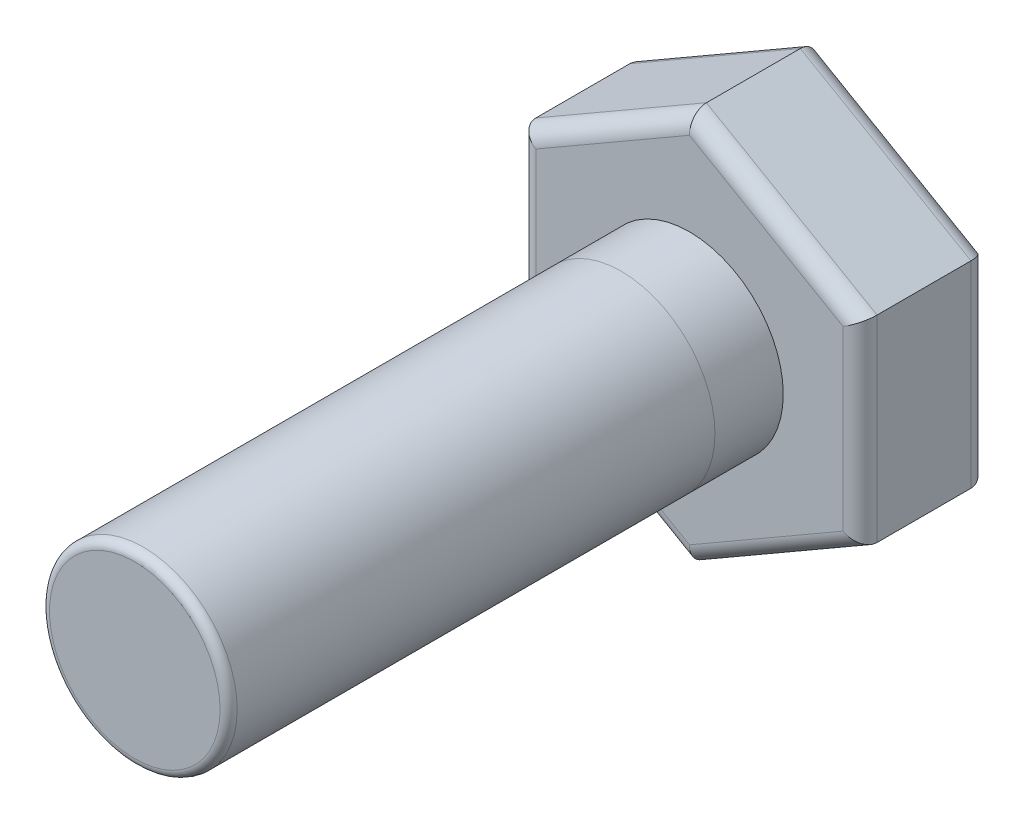
ISO-10303-21;
HEADER;
FILE_DESCRIPTION(('STEP AP214'),'2;1');
FILE_NAME('part.step','',(''),(''),'','','');
FILE_SCHEMA(('AUTOMOTIVE_DESIGN { 1 0 10303 214 1 1 1 1 }'));
ENDSEC;
DATA;
#1=APPLICATION_CONTEXT('core data for automotive mechanical design processes');
#2=APPLICATION_PROTOCOL_DEFINITION('international standard','automotive_design',2000,#1);
#3=PRODUCT_CONTEXT('',#1,'mechanical');
#4=PRODUCT('Part','Part','',(#3));
#5=PRODUCT_RELATED_PRODUCT_CATEGORY('part','',(#4));
#6=PRODUCT_DEFINITION_FORMATION('','',#4);
#7=PRODUCT_DEFINITION_CONTEXT('part definition',#1,'design');
#8=PRODUCT_DEFINITION('design','',#6,#7);
#9=PRODUCT_DEFINITION_SHAPE('','',#8);
#10=(LENGTH_UNIT() NAMED_UNIT(*) SI_UNIT(.MILLI.,.METRE.));
#11=(NAMED_UNIT(*) PLANE_ANGLE_UNIT() SI_UNIT($,.RADIAN.));
#12=(NAMED_UNIT(*) SI_UNIT($,.STERADIAN.) SOLID_ANGLE_UNIT());
#13=UNCERTAINTY_MEASURE_WITH_UNIT(LENGTH_MEASURE(1.E-05),#10,'distance_accuracy_value','');
#14=(GEOMETRIC_REPRESENTATION_CONTEXT(3) GLOBAL_UNCERTAINTY_ASSIGNED_CONTEXT((#13)) GLOBAL_UNIT_ASSIGNED_CONTEXT((#10,
#11,#12)) REPRESENTATION_CONTEXT('',''));
#15=CARTESIAN_POINT('',(0.,0.,0.));
#16=DIRECTION('',(0.,0.,1.));
#17=DIRECTION('',(1.,0.,0.));
#18=AXIS2_PLACEMENT_3D('',#15,#16,#17);
#19=CARTESIAN_POINT('',(20.,34.6410161513775,15.));
#20=DIRECTION('',(0.,0.,1.));
#21=DIRECTION('',(1.,0.,0.));
#22=AXIS2_PLACEMENT_3D('',#19,#20,#21);
#23=PLANE('',#22);
#24=DIRECTION('',(0.866025403784439,-0.5,0.));
#25=VECTOR('',#24,1.);
#26=CARTESIAN_POINT('',(1.,-21.3619599600162,15.));
#27=LINE('',#26,#25);
#28=CARTESIAN_POINT('',(-18.,-10.3923048454132,15.));
#29=VERTEX_POINT('',#28);
#30=CARTESIAN_POINT('',(0.,-20.7846096908265,15.));
#31=VERTEX_POINT('',#30);
#32=EDGE_CURVE('E49',#29,#31,#27,.T.);
#33=ORIENTED_EDGE('',*,*,#32,.T.);
#34=DIRECTION('',(0.866025403784439,0.5,0.));
#35=VECTOR('',#34,1.);
#36=CARTESIAN_POINT('',(19.,-9.81495457622364,15.));
#37=LINE('',#36,#35);
#38=CARTESIAN_POINT('',(18.,-10.3923048454133,15.));
#39=VERTEX_POINT('',#38);
#40=EDGE_CURVE('E204',#31,#39,#37,.T.);
#41=ORIENTED_EDGE('',*,*,#40,.T.);
#42=DIRECTION('',(0.,1.,0.));
#43=VECTOR('',#42,1.);
#44=CARTESIAN_POINT('',(18.,11.5470053837925,15.));
#45=LINE('',#44,#43);
#46=CARTESIAN_POINT('',(18.,10.3923048454133,15.));
#47=VERTEX_POINT('',#46);
#48=EDGE_CURVE('E199',#39,#47,#45,.T.);
#49=ORIENTED_EDGE('',*,*,#48,.T.);
#50=DIRECTION('',(-0.866025403784439,0.5,0.));
#51=VECTOR('',#50,1.);
#52=CARTESIAN_POINT('',(-0.999999999999994,21.3619599600162,15.));
#53=LINE('',#52,#51);
#54=CARTESIAN_POINT('',(0.,20.7846096908265,15.));
#55=VERTEX_POINT('',#54);
#56=EDGE_CURVE('E197',#47,#55,#53,.T.);
#57=ORIENTED_EDGE('',*,*,#56,.T.);
#58=DIRECTION('',(-0.866025403784439,-0.5,0.));
#59=VECTOR('',#58,1.);
#60=CARTESIAN_POINT('',(-19.,9.81495457622364,15.));
#61=LINE('',#60,#59);
#62=CARTESIAN_POINT('',(-18.,10.3923048454133,15.));
#63=VERTEX_POINT('',#62);
#64=EDGE_CURVE('E152',#55,#63,#61,.T.);
#65=ORIENTED_EDGE('',*,*,#64,.T.);
#66=DIRECTION('',(0.,-1.,0.));
#67=VECTOR('',#66,1.);
#68=CARTESIAN_POINT('',(-18.,-11.5470053837925,15.));
#69=LINE('',#68,#67);
#70=EDGE_CURVE('E54',#63,#29,#69,.T.);
#71=ORIENTED_EDGE('',*,*,#70,.T.);
#72=EDGE_LOOP('',(#33,#41,#49,#57,#65,#71));
#73=FACE_BOUND('',#72,.T.);
#74=CARTESIAN_POINT('',(0.,0.,15.));
#75=DIRECTION('',(0.,0.,1.));
#76=DIRECTION('',(1.,0.,0.));
#77=AXIS2_PLACEMENT_3D('',#74,#75,#76);
#78=CIRCLE('',#77,11.);
#79=CARTESIAN_POINT('',(11.,0.,15.));
#80=VERTEX_POINT('',#79);
#81=EDGE_CURVE('E222',#80,#80,#78,.T.);
#82=ORIENTED_EDGE('',*,*,#81,.F.);
#83=EDGE_LOOP('',(#82));
#84=FACE_BOUND('',#83,.T.);
#85=ADVANCED_FACE('F34',(#73,#84),#23,.T.);
#86=CARTESIAN_POINT('',(20.,-11.5470053837925,15.));
#87=DIRECTION('',(-1.,0.,0.));
#88=DIRECTION('',(0.,0.,1.));
#89=AXIS2_PLACEMENT_3D('',#86,#87,#88);
#90=PLANE('',#89);
#91=DIRECTION('',(0.,0.,-1.));
#92=VECTOR('',#91,1.);
#93=CARTESIAN_POINT('',(20.,-11.5470053837925,15.));
#94=LINE('',#93,#92);
#95=CARTESIAN_POINT('',(20.,-11.5470053837925,13.));
#96=VERTEX_POINT('',#95);
#97=CARTESIAN_POINT('',(20.,-11.5470053837925,2.));
#98=VERTEX_POINT('',#97);
#99=EDGE_CURVE('E477',#96,#98,#94,.T.);
#100=ORIENTED_EDGE('',*,*,#99,.T.);
#101=DIRECTION('',(0.,1.,0.));
#102=VECTOR('',#101,1.);
#103=CARTESIAN_POINT('',(20.,-11.5470053837925,2.));
#104=LINE('',#103,#102);
#105=CARTESIAN_POINT('',(20.,11.5470053837925,2.));
#106=VERTEX_POINT('',#105);
#107=EDGE_CURVE('E195',#98,#106,#104,.T.);
#108=ORIENTED_EDGE('',*,*,#107,.T.);
#109=DIRECTION('',(0.,0.,-1.));
#110=VECTOR('',#109,1.);
#111=CARTESIAN_POINT('',(20.,11.5470053837925,15.));
#112=LINE('',#111,#110);
#113=CARTESIAN_POINT('',(20.,11.5470053837925,13.));
#114=VERTEX_POINT('',#113);
#115=EDGE_CURVE('E146',#114,#106,#112,.T.);
#116=ORIENTED_EDGE('',*,*,#115,.F.);
#117=DIRECTION('',(0.,1.,0.));
#118=VECTOR('',#117,1.);
#119=CARTESIAN_POINT('',(20.,-11.5470053837925,13.));
#120=LINE('',#119,#118);
#121=EDGE_CURVE('E193',#114,#96,#120,.F.);
#122=ORIENTED_EDGE('',*,*,#121,.T.);
#123=EDGE_LOOP('',(#100,#108,#116,#122));
#124=FACE_BOUND('',#123,.T.);
#125=ADVANCED_FACE('F256',(#124),#90,.F.);
#126=CARTESIAN_POINT('',(20.,11.5470053837925,15.));
#127=DIRECTION('',(-0.5,-0.866025403784439,0.));
#128=DIRECTION('',(0.866025403784439,-0.5,0.));
#129=AXIS2_PLACEMENT_3D('',#126,#127,#128);
#130=PLANE('',#129);
#131=ORIENTED_EDGE('',*,*,#115,.T.);
#132=DIRECTION('',(-0.866025403784439,0.5,0.));
#133=VECTOR('',#132,1.);
#134=CARTESIAN_POINT('',(20.,11.5470053837925,2.));
#135=LINE('',#134,#133);
#136=CARTESIAN_POINT('',(0.,23.094010767585,2.));
#137=VERTEX_POINT('',#136);
#138=EDGE_CURVE('E145',#106,#137,#135,.T.);
#139=ORIENTED_EDGE('',*,*,#138,.T.);
#140=DIRECTION('',(0.,0.,-1.));
#141=VECTOR('',#140,1.);
#142=CARTESIAN_POINT('',(0.,23.094010767585,15.));
#143=LINE('',#142,#141);
#144=CARTESIAN_POINT('',(0.,23.094010767585,13.));
#145=VERTEX_POINT('',#144);
#146=EDGE_CURVE('E127',#145,#137,#143,.T.);
#147=ORIENTED_EDGE('',*,*,#146,.F.);
#148=DIRECTION('',(-0.866025403784439,0.5,0.));
#149=VECTOR('',#148,1.);
#150=CARTESIAN_POINT('',(20.,11.5470053837925,13.));
#151=LINE('',#150,#149);
#152=EDGE_CURVE('E142',#145,#114,#151,.F.);
#153=ORIENTED_EDGE('',*,*,#152,.T.);
#154=EDGE_LOOP('',(#131,#139,#147,#153));
#155=FACE_BOUND('',#154,.T.);
#156=ADVANCED_FACE('F140',(#155),#130,.F.);
#157=CARTESIAN_POINT('',(0.,23.094010767585,15.));
#158=DIRECTION('',(0.5,-0.866025403784439,0.));
#159=DIRECTION('',(0.866025403784439,0.5,0.));
#160=AXIS2_PLACEMENT_3D('',#157,#158,#159);
#161=PLANE('',#160);
#162=ORIENTED_EDGE('',*,*,#146,.T.);
#163=DIRECTION('',(-0.866025403784439,-0.5,0.));
#164=VECTOR('',#163,1.);
#165=CARTESIAN_POINT('',(0.,23.094010767585,2.));
#166=LINE('',#165,#164);
#167=CARTESIAN_POINT('',(-20.,11.5470053837925,2.));
#168=VERTEX_POINT('',#167);
#169=EDGE_CURVE('E134',#137,#168,#166,.T.);
#170=ORIENTED_EDGE('',*,*,#169,.T.);
#171=DIRECTION('',(0.,0.,-1.));
#172=VECTOR('',#171,1.);
#173=CARTESIAN_POINT('',(-20.,11.5470053837925,15.));
#174=LINE('',#173,#172);
#175=CARTESIAN_POINT('',(-20.,11.5470053837925,13.));
#176=VERTEX_POINT('',#175);
#177=EDGE_CURVE('E129',#176,#168,#174,.T.);
#178=ORIENTED_EDGE('',*,*,#177,.F.);
#179=DIRECTION('',(-0.866025403784439,-0.5,0.));
#180=VECTOR('',#179,1.);
#181=CARTESIAN_POINT('',(0.,23.094010767585,13.));
#182=LINE('',#181,#180);
#183=EDGE_CURVE('E124',#176,#145,#182,.F.);
#184=ORIENTED_EDGE('',*,*,#183,.T.);
#185=EDGE_LOOP('',(#162,#170,#178,#184));
#186=FACE_BOUND('',#185,.T.);
#187=ADVANCED_FACE('F126',(#186),#161,.F.);
#188=CARTESIAN_POINT('',(-20.,11.5470053837925,15.));
#189=DIRECTION('',(1.,0.,0.));
#190=DIRECTION('',(0.,0.,-1.));
#191=AXIS2_PLACEMENT_3D('',#188,#189,#190);
#192=PLANE('',#191);
#193=ORIENTED_EDGE('',*,*,#177,.T.);
#194=DIRECTION('',(0.,-1.,0.));
#195=VECTOR('',#194,1.);
#196=CARTESIAN_POINT('',(-20.,11.5470053837925,2.));
#197=LINE('',#196,#195);
#198=CARTESIAN_POINT('',(-20.,-11.5470053837925,2.));
#199=VERTEX_POINT('',#198);
#200=EDGE_CURVE('E182',#168,#199,#197,.T.);
#201=ORIENTED_EDGE('',*,*,#200,.T.);
#202=DIRECTION('',(0.,0.,-1.));
#203=VECTOR('',#202,1.);
#204=CARTESIAN_POINT('',(-20.,-11.5470053837925,15.));
#205=LINE('',#204,#203);
#206=CARTESIAN_POINT('',(-20.,-11.5470053837925,13.));
#207=VERTEX_POINT('',#206);
#208=EDGE_CURVE('E494',#207,#199,#205,.T.);
#209=ORIENTED_EDGE('',*,*,#208,.F.);
#210=DIRECTION('',(0.,-1.,0.));
#211=VECTOR('',#210,1.);
#212=CARTESIAN_POINT('',(-20.,11.5470053837925,13.));
#213=LINE('',#212,#211);
#214=EDGE_CURVE('E180',#207,#176,#213,.F.);
#215=ORIENTED_EDGE('',*,*,#214,.T.);
#216=EDGE_LOOP('',(#193,#201,#209,#215));
#217=FACE_BOUND('',#216,.T.);
#218=ADVANCED_FACE('F267',(#217),#192,.F.);
#219=CARTESIAN_POINT('',(-20.,-11.5470053837925,15.));
#220=DIRECTION('',(0.5,0.866025403784438,0.));
#221=DIRECTION('',(-0.866025403784439,0.5,0.));
#222=AXIS2_PLACEMENT_3D('',#219,#220,#221);
#223=PLANE('',#222);
#224=ORIENTED_EDGE('',*,*,#208,.T.);
#225=DIRECTION('',(0.866025403784439,-0.5,0.));
#226=VECTOR('',#225,1.);
#227=CARTESIAN_POINT('',(-20.,-11.5470053837925,2.));
#228=LINE('',#227,#226);
#229=CARTESIAN_POINT('',(0.,-23.094010767585,2.));
#230=VERTEX_POINT('',#229);
#231=EDGE_CURVE('E186',#199,#230,#228,.T.);
#232=ORIENTED_EDGE('',*,*,#231,.T.);
#233=DIRECTION('',(0.,0.,-1.));
#234=VECTOR('',#233,1.);
#235=CARTESIAN_POINT('',(0.,-23.094010767585,15.));
#236=LINE('',#235,#234);
#237=CARTESIAN_POINT('',(0.,-23.094010767585,13.));
#238=VERTEX_POINT('',#237);
#239=EDGE_CURVE('E491',#238,#230,#236,.T.);
#240=ORIENTED_EDGE('',*,*,#239,.F.);
#241=DIRECTION('',(0.866025403784439,-0.5,0.));
#242=VECTOR('',#241,1.);
#243=CARTESIAN_POINT('',(-20.,-11.5470053837925,13.));
#244=LINE('',#243,#242);
#245=EDGE_CURVE('E184',#238,#207,#244,.F.);
#246=ORIENTED_EDGE('',*,*,#245,.T.);
#247=EDGE_LOOP('',(#224,#232,#240,#246));
#248=FACE_BOUND('',#247,.T.);
#249=ADVANCED_FACE('F263',(#248),#223,.F.);
#250=CARTESIAN_POINT('',(0.,-23.094010767585,15.));
#251=DIRECTION('',(-0.5,0.866025403784439,0.));
#252=DIRECTION('',(-0.866025403784439,-0.5,0.));
#253=AXIS2_PLACEMENT_3D('',#250,#251,#252);
#254=PLANE('',#253);
#255=ORIENTED_EDGE('',*,*,#239,.T.);
#256=DIRECTION('',(0.866025403784439,0.5,0.));
#257=VECTOR('',#256,1.);
#258=CARTESIAN_POINT('',(0.,-23.094010767585,2.));
#259=LINE('',#258,#257);
#260=EDGE_CURVE('E191',#230,#98,#259,.T.);
#261=ORIENTED_EDGE('',*,*,#260,.T.);
#262=ORIENTED_EDGE('',*,*,#99,.F.);
#263=DIRECTION('',(0.866025403784439,0.5,0.));
#264=VECTOR('',#263,1.);
#265=CARTESIAN_POINT('',(0.,-23.094010767585,13.));
#266=LINE('',#265,#264);
#267=EDGE_CURVE('E188',#96,#238,#266,.F.);
#268=ORIENTED_EDGE('',*,*,#267,.T.);
#269=EDGE_LOOP('',(#255,#261,#262,#268));
#270=FACE_BOUND('',#269,.T.);
#271=ADVANCED_FACE('F259',(#270),#254,.F.);
#272=CARTESIAN_POINT('',(20.,34.6410161513775,0.));
#273=DIRECTION('',(0.,0.,1.));
#274=DIRECTION('',(1.,0.,0.));
#275=AXIS2_PLACEMENT_3D('',#272,#273,#274);
#276=PLANE('',#275);
#277=DIRECTION('',(-0.866025403784439,-0.5,0.));
#278=VECTOR('',#277,1.);
#279=CARTESIAN_POINT('',(21.,32.9089653438087,0.));
#280=LINE('',#279,#278);
#281=CARTESIAN_POINT('',(-18.,10.3923048454133,0.));
#282=VERTEX_POINT('',#281);
#283=CARTESIAN_POINT('',(0.,20.7846096908265,0.));
#284=VERTEX_POINT('',#283);
#285=EDGE_CURVE('E175',#282,#284,#280,.F.);
#286=ORIENTED_EDGE('',*,*,#285,.T.);
#287=DIRECTION('',(-0.866025403784439,0.5,0.));
#288=VECTOR('',#287,1.);
#289=CARTESIAN_POINT('',(9.00000000000001,15.5884572681199,0.));
#290=LINE('',#289,#288);
#291=CARTESIAN_POINT('',(18.,10.3923048454133,0.));
#292=VERTEX_POINT('',#291);
#293=EDGE_CURVE('E135',#284,#292,#290,.F.);
#294=ORIENTED_EDGE('',*,*,#293,.T.);
#295=DIRECTION('',(0.,1.,0.));
#296=VECTOR('',#295,1.);
#297=CARTESIAN_POINT('',(18.,34.6410161513775,0.));
#298=LINE('',#297,#296);
#299=CARTESIAN_POINT('',(18.,-10.3923048454133,0.));
#300=VERTEX_POINT('',#299);
#301=EDGE_CURVE('E164',#292,#300,#298,.F.);
#302=ORIENTED_EDGE('',*,*,#301,.T.);
#303=DIRECTION('',(0.866025403784439,0.5,0.));
#304=VECTOR('',#303,1.);
#305=CARTESIAN_POINT('',(39.,1.73205080756887,0.));
#306=LINE('',#305,#304);
#307=CARTESIAN_POINT('',(0.,-20.7846096908265,0.));
#308=VERTEX_POINT('',#307);
#309=EDGE_CURVE('E169',#300,#308,#306,.F.);
#310=ORIENTED_EDGE('',*,*,#309,.T.);
#311=DIRECTION('',(0.866025403784439,-0.5,0.));
#312=VECTOR('',#311,1.);
#313=CARTESIAN_POINT('',(-9.00000000000001,-15.5884572681199,0.));
#314=LINE('',#313,#312);
#315=CARTESIAN_POINT('',(-18.,-10.3923048454133,0.));
#316=VERTEX_POINT('',#315);
#317=EDGE_CURVE('E171',#308,#316,#314,.F.);
#318=ORIENTED_EDGE('',*,*,#317,.T.);
#319=DIRECTION('',(0.,-1.,0.));
#320=VECTOR('',#319,1.);
#321=CARTESIAN_POINT('',(-18.,34.6410161513775,0.));
#322=LINE('',#321,#320);
#323=EDGE_CURVE('E173',#316,#282,#322,.F.);
#324=ORIENTED_EDGE('',*,*,#323,.T.);
#325=EDGE_LOOP('',(#286,#294,#302,#310,#318,#324));
#326=FACE_BOUND('',#325,.T.);
#327=ADVANCED_FACE('F250',(#326),#276,.F.);
#328=CARTESIAN_POINT('',(0.,0.,23.));
#329=DIRECTION('',(0.,0.,-1.));
#330=DIRECTION('',(-1.,0.,0.));
#331=AXIS2_PLACEMENT_3D('',#328,#329,#330);
#332=CYLINDRICAL_SURFACE('',#331,11.);
#333=CARTESIAN_POINT('',(0.,0.,23.));
#334=DIRECTION('',(0.,0.,1.));
#335=DIRECTION('',(1.,0.,0.));
#336=AXIS2_PLACEMENT_3D('',#333,#334,#335);
#337=CIRCLE('',#336,10.995);
#338=CARTESIAN_POINT('',(10.995,0.,23.));
#339=VERTEX_POINT('',#338);
#340=EDGE_CURVE('E235',#339,#339,#337,.T.);
#341=ORIENTED_EDGE('',*,*,#340,.F.);
#342=EDGE_LOOP('',(#341));
#343=FACE_BOUND('',#342,.T.);
#344=ORIENTED_EDGE('',*,*,#81,.T.);
#345=EDGE_LOOP('',(#344));
#346=FACE_BOUND('',#345,.T.);
#347=ADVANCED_FACE('F239',(#343,#346),#332,.T.);
#348=CARTESIAN_POINT('',(-19.,-9.81495457622363,2.));
#349=DIRECTION('',(0.866025403784439,-0.5,0.));
#350=DIRECTION('',(0.5,0.866025403784438,0.));
#351=AXIS2_PLACEMENT_3D('',#348,#349,#350);
#352=CYLINDRICAL_SURFACE('',#351,2.);
#353=CARTESIAN_POINT('',(-18.,-10.3923048454133,2.));
#354=DIRECTION('',(0.5,-0.866025403784439,0.));
#355=DIRECTION('',(0.866025403784439,0.5,0.));
#356=AXIS2_PLACEMENT_3D('',#353,#354,#355);
#357=ELLIPSE('',#356,2.3094010767585,2.);
#358=EDGE_CURVE('E216',#316,#199,#357,.F.);
#359=ORIENTED_EDGE('',*,*,#358,.F.);
#360=ORIENTED_EDGE('',*,*,#317,.F.);
#361=CARTESIAN_POINT('',(0.,-20.7846096908265,2.));
#362=DIRECTION('',(1.,0.,0.));
#363=DIRECTION('',(0.,1.,0.));
#364=AXIS2_PLACEMENT_3D('',#361,#362,#363);
#365=ELLIPSE('',#364,2.3094010767585,2.);
#366=EDGE_CURVE('E219',#230,#308,#365,.T.);
#367=ORIENTED_EDGE('',*,*,#366,.F.);
#368=ORIENTED_EDGE('',*,*,#231,.F.);
#369=EDGE_LOOP('',(#359,#360,#367,#368));
#370=FACE_BOUND('',#369,.T.);
#371=ADVANCED_FACE('F249',(#370),#352,.T.);
#372=CARTESIAN_POINT('',(-1.,-21.3619599600162,2.));
#373=DIRECTION('',(0.866025403784439,0.5,0.));
#374=DIRECTION('',(-0.5,0.866025403784439,0.));
#375=AXIS2_PLACEMENT_3D('',#372,#373,#374);
#376=CYLINDRICAL_SURFACE('',#375,2.);
#377=ORIENTED_EDGE('',*,*,#366,.T.);
#378=ORIENTED_EDGE('',*,*,#309,.F.);
#379=CARTESIAN_POINT('',(18.,-10.3923048454133,2.));
#380=DIRECTION('',(0.5,0.866025403784439,0.));
#381=DIRECTION('',(-0.866025403784439,0.5,0.));
#382=AXIS2_PLACEMENT_3D('',#379,#380,#381);
#383=ELLIPSE('',#382,2.3094010767585,2.);
#384=EDGE_CURVE('E213',#98,#300,#383,.T.);
#385=ORIENTED_EDGE('',*,*,#384,.F.);
#386=ORIENTED_EDGE('',*,*,#260,.F.);
#387=EDGE_LOOP('',(#377,#378,#385,#386));
#388=FACE_BOUND('',#387,.T.);
#389=ADVANCED_FACE('F294',(#388),#376,.T.);
#390=CARTESIAN_POINT('',(-18.,11.5470053837925,2.));
#391=DIRECTION('',(0.,-1.,0.));
#392=DIRECTION('',(0.,0.,-1.));
#393=AXIS2_PLACEMENT_3D('',#390,#391,#392);
#394=CYLINDRICAL_SURFACE('',#393,2.);
#395=ORIENTED_EDGE('',*,*,#358,.T.);
#396=ORIENTED_EDGE('',*,*,#200,.F.);
#397=CARTESIAN_POINT('',(-18.,10.3923048454133,2.));
#398=DIRECTION('',(-0.5,-0.866025403784439,0.));
#399=DIRECTION('',(0.866025403784439,-0.5,0.));
#400=AXIS2_PLACEMENT_3D('',#397,#398,#399);
#401=ELLIPSE('',#400,2.3094010767585,2.);
#402=EDGE_CURVE('E210',#282,#168,#401,.F.);
#403=ORIENTED_EDGE('',*,*,#402,.F.);
#404=ORIENTED_EDGE('',*,*,#323,.F.);
#405=EDGE_LOOP('',(#395,#396,#403,#404));
#406=FACE_BOUND('',#405,.T.);
#407=ADVANCED_FACE('F290',(#406),#394,.T.);
#408=CARTESIAN_POINT('',(18.,-11.5470053837925,2.));
#409=DIRECTION('',(0.,1.,0.));
#410=DIRECTION('',(0.,0.,1.));
#411=AXIS2_PLACEMENT_3D('',#408,#409,#410);
#412=CYLINDRICAL_SURFACE('',#411,2.);
#413=ORIENTED_EDGE('',*,*,#384,.T.);
#414=ORIENTED_EDGE('',*,*,#301,.F.);
#415=CARTESIAN_POINT('',(18.,10.3923048454133,2.));
#416=DIRECTION('',(-0.5,0.866025403784439,0.));
#417=DIRECTION('',(0.866025403784439,0.5,0.));
#418=AXIS2_PLACEMENT_3D('',#415,#416,#417);
#419=ELLIPSE('',#418,2.3094010767585,2.);
#420=EDGE_CURVE('E208',#106,#292,#419,.T.);
#421=ORIENTED_EDGE('',*,*,#420,.F.);
#422=ORIENTED_EDGE('',*,*,#107,.F.);
#423=EDGE_LOOP('',(#413,#414,#421,#422));
#424=FACE_BOUND('',#423,.T.);
#425=ADVANCED_FACE('F286',(#424),#412,.T.);
#426=CARTESIAN_POINT('',(1.00000000000001,21.3619599600162,2.));
#427=DIRECTION('',(-0.866025403784439,-0.5,0.));
#428=DIRECTION('',(0.5,-0.866025403784439,0.));
#429=AXIS2_PLACEMENT_3D('',#426,#427,#428);
#430=CYLINDRICAL_SURFACE('',#429,2.);
#431=ORIENTED_EDGE('',*,*,#402,.T.);
#432=ORIENTED_EDGE('',*,*,#169,.F.);
#433=CARTESIAN_POINT('',(0.,20.7846096908265,2.));
#434=DIRECTION('',(-1.,0.,0.));
#435=DIRECTION('',(0.,-1.,0.));
#436=AXIS2_PLACEMENT_3D('',#433,#434,#435);
#437=ELLIPSE('',#436,2.3094010767585,2.);
#438=EDGE_CURVE('E206',#284,#137,#437,.F.);
#439=ORIENTED_EDGE('',*,*,#438,.F.);
#440=ORIENTED_EDGE('',*,*,#285,.F.);
#441=EDGE_LOOP('',(#431,#432,#439,#440));
#442=FACE_BOUND('',#441,.T.);
#443=ADVANCED_FACE('F282',(#442),#430,.T.);
#444=CARTESIAN_POINT('',(19.,9.81495457622364,2.));
#445=DIRECTION('',(-0.866025403784439,0.5,0.));
#446=DIRECTION('',(-0.5,-0.866025403784439,0.));
#447=AXIS2_PLACEMENT_3D('',#444,#445,#446);
#448=CYLINDRICAL_SURFACE('',#447,2.);
#449=ORIENTED_EDGE('',*,*,#420,.T.);
#450=ORIENTED_EDGE('',*,*,#293,.F.);
#451=ORIENTED_EDGE('',*,*,#438,.T.);
#452=ORIENTED_EDGE('',*,*,#138,.F.);
#453=EDGE_LOOP('',(#449,#450,#451,#452));
#454=FACE_BOUND('',#453,.T.);
#455=ADVANCED_FACE('F279',(#454),#448,.T.);
#456=CARTESIAN_POINT('',(21.,32.9089653438087,13.));
#457=DIRECTION('',(0.866025403784439,0.5,0.));
#458=DIRECTION('',(-0.5,0.866025403784439,0.));
#459=AXIS2_PLACEMENT_3D('',#456,#457,#458);
#460=CYLINDRICAL_SURFACE('',#459,2.);
#461=CARTESIAN_POINT('',(0.,20.7846096908265,13.));
#462=DIRECTION('',(1.,0.,0.));
#463=DIRECTION('',(0.,-1.,0.));
#464=AXIS2_PLACEMENT_3D('',#461,#462,#463);
#465=ELLIPSE('',#464,2.3094010767585,2.);
#466=EDGE_CURVE('E150',#145,#55,#465,.T.);
#467=ORIENTED_EDGE('',*,*,#466,.F.);
#468=ORIENTED_EDGE('',*,*,#183,.F.);
#469=CARTESIAN_POINT('',(-18.,10.3923048454133,13.));
#470=DIRECTION('',(0.5,0.866025403784439,0.));
#471=DIRECTION('',(0.866025403784439,-0.5,0.));
#472=AXIS2_PLACEMENT_3D('',#469,#470,#471);
#473=ELLIPSE('',#472,2.3094010767585,2.);
#474=EDGE_CURVE('E155',#63,#176,#473,.F.);
#475=ORIENTED_EDGE('',*,*,#474,.F.);
#476=ORIENTED_EDGE('',*,*,#64,.F.);
#477=EDGE_LOOP('',(#467,#468,#475,#476));
#478=FACE_BOUND('',#477,.T.);
#479=ADVANCED_FACE('F151',(#478),#460,.T.);
#480=CARTESIAN_POINT('',(-18.,34.6410161513775,13.));
#481=DIRECTION('',(0.,1.,0.));
#482=DIRECTION('',(0.,0.,1.));
#483=AXIS2_PLACEMENT_3D('',#480,#481,#482);
#484=CYLINDRICAL_SURFACE('',#483,2.);
#485=ORIENTED_EDGE('',*,*,#474,.T.);
#486=ORIENTED_EDGE('',*,*,#214,.F.);
#487=CARTESIAN_POINT('',(-18.,-10.3923048454132,13.));
#488=DIRECTION('',(-0.5,0.866025403784439,0.));
#489=DIRECTION('',(0.866025403784439,0.5,0.));
#490=AXIS2_PLACEMENT_3D('',#487,#488,#489);
#491=ELLIPSE('',#490,2.3094010767585,2.);
#492=EDGE_CURVE('E156',#29,#207,#491,.F.);
#493=ORIENTED_EDGE('',*,*,#492,.F.);
#494=ORIENTED_EDGE('',*,*,#70,.F.);
#495=EDGE_LOOP('',(#485,#486,#493,#494));
#496=FACE_BOUND('',#495,.T.);
#497=ADVANCED_FACE('F316',(#496),#484,.T.);
#498=CARTESIAN_POINT('',(9.00000000000001,15.5884572681199,13.));
#499=DIRECTION('',(0.866025403784439,-0.5,0.));
#500=DIRECTION('',(0.5,0.866025403784439,0.));
#501=AXIS2_PLACEMENT_3D('',#498,#499,#500);
#502=CYLINDRICAL_SURFACE('',#501,2.);
#503=ORIENTED_EDGE('',*,*,#466,.T.);
#504=ORIENTED_EDGE('',*,*,#56,.F.);
#505=CARTESIAN_POINT('',(18.,10.3923048454133,13.));
#506=DIRECTION('',(0.5,-0.866025403784439,0.));
#507=DIRECTION('',(0.866025403784439,0.5,0.));
#508=AXIS2_PLACEMENT_3D('',#505,#506,#507);
#509=ELLIPSE('',#508,2.3094010767585,2.);
#510=EDGE_CURVE('E161',#114,#47,#509,.T.);
#511=ORIENTED_EDGE('',*,*,#510,.F.);
#512=ORIENTED_EDGE('',*,*,#152,.F.);
#513=EDGE_LOOP('',(#503,#504,#511,#512));
#514=FACE_BOUND('',#513,.T.);
#515=ADVANCED_FACE('F159',(#514),#502,.T.);
#516=CARTESIAN_POINT('',(-9.00000000000001,-15.5884572681199,13.));
#517=DIRECTION('',(-0.866025403784439,0.5,0.));
#518=DIRECTION('',(-0.5,-0.866025403784438,0.));
#519=AXIS2_PLACEMENT_3D('',#516,#517,#518);
#520=CYLINDRICAL_SURFACE('',#519,2.);
#521=ORIENTED_EDGE('',*,*,#492,.T.);
#522=ORIENTED_EDGE('',*,*,#245,.F.);
#523=CARTESIAN_POINT('',(0.,-20.7846096908265,13.));
#524=DIRECTION('',(-1.,0.,0.));
#525=DIRECTION('',(0.,1.,0.));
#526=AXIS2_PLACEMENT_3D('',#523,#524,#525);
#527=ELLIPSE('',#526,2.3094010767585,2.);
#528=EDGE_CURVE('E225',#31,#238,#527,.F.);
#529=ORIENTED_EDGE('',*,*,#528,.F.);
#530=ORIENTED_EDGE('',*,*,#32,.F.);
#531=EDGE_LOOP('',(#521,#522,#529,#530));
#532=FACE_BOUND('',#531,.T.);
#533=ADVANCED_FACE('F309',(#532),#520,.T.);
#534=CARTESIAN_POINT('',(18.,34.6410161513775,13.));
#535=DIRECTION('',(0.,-1.,0.));
#536=DIRECTION('',(0.,0.,-1.));
#537=AXIS2_PLACEMENT_3D('',#534,#535,#536);
#538=CYLINDRICAL_SURFACE('',#537,2.);
#539=ORIENTED_EDGE('',*,*,#510,.T.);
#540=ORIENTED_EDGE('',*,*,#48,.F.);
#541=CARTESIAN_POINT('',(18.,-10.3923048454133,13.));
#542=DIRECTION('',(-0.5,-0.866025403784439,0.));
#543=DIRECTION('',(0.866025403784439,-0.5,0.));
#544=AXIS2_PLACEMENT_3D('',#541,#542,#543);
#545=ELLIPSE('',#544,2.3094010767585,2.);
#546=EDGE_CURVE('E223',#96,#39,#545,.T.);
#547=ORIENTED_EDGE('',*,*,#546,.F.);
#548=ORIENTED_EDGE('',*,*,#121,.F.);
#549=EDGE_LOOP('',(#539,#540,#547,#548));
#550=FACE_BOUND('',#549,.T.);
#551=ADVANCED_FACE('F305',(#550),#538,.T.);
#552=CARTESIAN_POINT('',(39.,1.73205080756887,13.));
#553=DIRECTION('',(-0.866025403784439,-0.5,0.));
#554=DIRECTION('',(0.5,-0.866025403784439,0.));
#555=AXIS2_PLACEMENT_3D('',#552,#553,#554);
#556=CYLINDRICAL_SURFACE('',#555,2.);
#557=ORIENTED_EDGE('',*,*,#528,.T.);
#558=ORIENTED_EDGE('',*,*,#267,.F.);
#559=ORIENTED_EDGE('',*,*,#546,.T.);
#560=ORIENTED_EDGE('',*,*,#40,.F.);
#561=EDGE_LOOP('',(#557,#558,#559,#560));
#562=FACE_BOUND('',#561,.T.);
#563=ADVANCED_FACE('F302',(#562),#556,.T.);
#564=CARTESIAN_POINT('',(0.,0.,80.));
#565=DIRECTION('',(0.,0.,-1.));
#566=DIRECTION('',(-1.,0.,0.));
#567=AXIS2_PLACEMENT_3D('',#564,#565,#566);
#568=CYLINDRICAL_SURFACE('',#567,10.995);
#569=CARTESIAN_POINT('',(0.,0.,79.));
#570=DIRECTION('',(0.,0.,1.));
#571=DIRECTION('',(1.,0.,0.));
#572=AXIS2_PLACEMENT_3D('',#569,#570,#571);
#573=CIRCLE('',#572,10.995);
#574=CARTESIAN_POINT('',(10.995,0.,79.));
#575=VERTEX_POINT('',#574);
#576=EDGE_CURVE('E11',#575,#575,#573,.F.);
#577=ORIENTED_EDGE('',*,*,#576,.T.);
#578=EDGE_LOOP('',(#577));
#579=FACE_BOUND('',#578,.T.);
#580=ORIENTED_EDGE('',*,*,#340,.T.);
#581=EDGE_LOOP('',(#580));
#582=FACE_BOUND('',#581,.T.);
#583=ADVANCED_FACE('F251',(#579,#582),#568,.T.);
#584=CARTESIAN_POINT('',(0.,0.,80.));
#585=DIRECTION('',(0.,0.,1.));
#586=DIRECTION('',(1.,0.,0.));
#587=AXIS2_PLACEMENT_3D('',#584,#585,#586);
#588=PLANE('',#587);
#589=CARTESIAN_POINT('',(0.,0.,80.));
#590=DIRECTION('',(0.,0.,1.));
#591=DIRECTION('',(1.,0.,0.));
#592=AXIS2_PLACEMENT_3D('',#589,#590,#591);
#593=CIRCLE('',#592,9.995);
#594=CARTESIAN_POINT('',(9.995,0.,80.));
#595=VERTEX_POINT('',#594);
#596=EDGE_CURVE('E42',#595,#595,#593,.T.);
#597=ORIENTED_EDGE('',*,*,#596,.T.);
#598=EDGE_LOOP('',(#597));
#599=FACE_BOUND('',#598,.T.);
#600=ADVANCED_FACE('F351',(#599),#588,.T.);
#601=CARTESIAN_POINT('',(0.,0.,79.));
#602=DIRECTION('',(0.,0.,1.));
#603=DIRECTION('',(1.,0.,0.));
#604=AXIS2_PLACEMENT_3D('',#601,#602,#603);
#605=TOROIDAL_SURFACE('',#604,9.995,1.);
#606=ORIENTED_EDGE('',*,*,#576,.F.);
#607=EDGE_LOOP('',(#606));
#608=FACE_BOUND('',#607,.T.);
#609=ORIENTED_EDGE('',*,*,#596,.F.);
#610=EDGE_LOOP('',(#609));
#611=FACE_BOUND('',#610,.T.);
#612=ADVANCED_FACE('F36',(#608,#611),#605,.T.);
#613=CLOSED_SHELL('',(#85,#125,#156,#187,#218,#249,#271,#327,#347,#371,#389,#407,#425,#443,#455,
#479,#497,#515,#533,#551,#563,#583,#600,#612));
#614=MANIFOLD_SOLID_BREP('B2',#613);
#615=ADVANCED_BREP_SHAPE_REPRESENTATION('',(#18,#614),#14);
#616=SHAPE_DEFINITION_REPRESENTATION(#9,#615);
ENDSEC;
END-ISO-10303-21;
